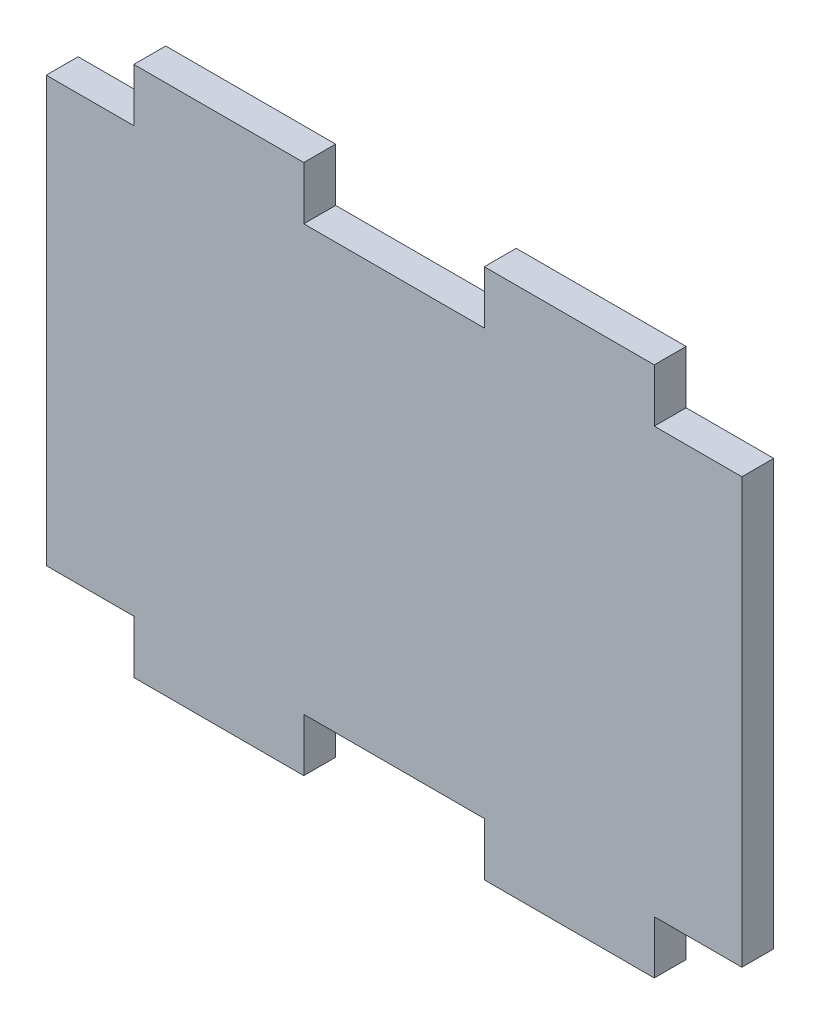
ISO-10303-21;
HEADER;
FILE_DESCRIPTION(('STEP AP214'),'2;1');
FILE_NAME('part.step','',(''),(''),'','','');
FILE_SCHEMA(('AUTOMOTIVE_DESIGN { 1 0 10303 214 1 1 1 1 }'));
ENDSEC;
DATA;
#1=APPLICATION_CONTEXT('core data for automotive mechanical design processes');
#2=APPLICATION_PROTOCOL_DEFINITION('international standard','automotive_design',2000,#1);
#3=PRODUCT_CONTEXT('',#1,'mechanical');
#4=PRODUCT('Part','Part','',(#3));
#5=PRODUCT_RELATED_PRODUCT_CATEGORY('part','',(#4));
#6=PRODUCT_DEFINITION_FORMATION('','',#4);
#7=PRODUCT_DEFINITION_CONTEXT('part definition',#1,'design');
#8=PRODUCT_DEFINITION('design','',#6,#7);
#9=PRODUCT_DEFINITION_SHAPE('','',#8);
#10=(LENGTH_UNIT() NAMED_UNIT(*) SI_UNIT(.MILLI.,.METRE.));
#11=(NAMED_UNIT(*) PLANE_ANGLE_UNIT() SI_UNIT($,.RADIAN.));
#12=(NAMED_UNIT(*) SI_UNIT($,.STERADIAN.) SOLID_ANGLE_UNIT());
#13=UNCERTAINTY_MEASURE_WITH_UNIT(LENGTH_MEASURE(1.E-05),#10,'distance_accuracy_value','');
#14=(GEOMETRIC_REPRESENTATION_CONTEXT(3) GLOBAL_UNCERTAINTY_ASSIGNED_CONTEXT((#13)) GLOBAL_UNIT_ASSIGNED_CONTEXT((#10,
#11,#12)) REPRESENTATION_CONTEXT('',''));
#15=CARTESIAN_POINT('',(0.,0.,0.));
#16=DIRECTION('',(0.,0.,1.));
#17=DIRECTION('',(1.,0.,0.));
#18=AXIS2_PLACEMENT_3D('',#15,#16,#17);
#19=CARTESIAN_POINT('',(-49.,6.,6.));
#20=DIRECTION('',(0.,-1.,0.));
#21=DIRECTION('',(1.,0.,0.));
#22=AXIS2_PLACEMENT_3D('',#19,#20,#21);
#23=PLANE('',#22);
#24=DIRECTION('',(-1.,0.,0.));
#25=VECTOR('',#24,1.);
#26=CARTESIAN_POINT('',(-49.,6.,0.));
#27=LINE('',#26,#25);
#28=CARTESIAN_POINT('',(-49.,6.,0.));
#29=VERTEX_POINT('',#28);
#30=CARTESIAN_POINT('',(-65.5,6.00000000000001,0.));
#31=VERTEX_POINT('',#30);
#32=EDGE_CURVE('E202',#29,#31,#27,.T.);
#33=ORIENTED_EDGE('',*,*,#32,.F.);
#34=DIRECTION('',(0.,0.,-1.));
#35=VECTOR('',#34,1.);
#36=CARTESIAN_POINT('',(-49.,6.,6.));
#37=LINE('',#36,#35);
#38=CARTESIAN_POINT('',(-49.,6.,6.));
#39=VERTEX_POINT('',#38);
#40=EDGE_CURVE('E11',#39,#29,#37,.T.);
#41=ORIENTED_EDGE('',*,*,#40,.F.);
#42=DIRECTION('',(-1.,0.,0.));
#43=VECTOR('',#42,1.);
#44=CARTESIAN_POINT('',(-49.,6.,6.));
#45=LINE('',#44,#43);
#46=CARTESIAN_POINT('',(-65.5,6.00000000000001,6.));
#47=VERTEX_POINT('',#46);
#48=EDGE_CURVE('E253',#39,#47,#45,.T.);
#49=ORIENTED_EDGE('',*,*,#48,.T.);
#50=DIRECTION('',(0.,0.,-1.));
#51=VECTOR('',#50,1.);
#52=CARTESIAN_POINT('',(-65.5,6.00000000000001,6.));
#53=LINE('',#52,#51);
#54=EDGE_CURVE('E36',#47,#31,#53,.T.);
#55=ORIENTED_EDGE('',*,*,#54,.T.);
#56=EDGE_LOOP('',(#33,#41,#49,#55));
#57=FACE_BOUND('',#56,.T.);
#58=ADVANCED_FACE('F33',(#57),#23,.T.);
#59=CARTESIAN_POINT('',(-49.,-3.99999999999999,6.));
#60=DIRECTION('',(-1.,0.,0.));
#61=DIRECTION('',(0.,-1.,0.));
#62=AXIS2_PLACEMENT_3D('',#59,#60,#61);
#63=PLANE('',#62);
#64=DIRECTION('',(0.,1.,0.));
#65=VECTOR('',#64,1.);
#66=CARTESIAN_POINT('',(-49.,-3.99999999999999,0.));
#67=LINE('',#66,#65);
#68=CARTESIAN_POINT('',(-49.,-3.99999999999999,0.));
#69=VERTEX_POINT('',#68);
#70=EDGE_CURVE('E251',#69,#29,#67,.T.);
#71=ORIENTED_EDGE('',*,*,#70,.F.);
#72=DIRECTION('',(0.,0.,-1.));
#73=VECTOR('',#72,1.);
#74=CARTESIAN_POINT('',(-49.,-3.99999999999999,6.));
#75=LINE('',#74,#73);
#76=CARTESIAN_POINT('',(-49.,-3.99999999999999,6.));
#77=VERTEX_POINT('',#76);
#78=EDGE_CURVE('E42',#77,#69,#75,.T.);
#79=ORIENTED_EDGE('',*,*,#78,.F.);
#80=DIRECTION('',(0.,1.,0.));
#81=VECTOR('',#80,1.);
#82=CARTESIAN_POINT('',(-49.,-3.99999999999999,6.));
#83=LINE('',#82,#81);
#84=EDGE_CURVE('E182',#77,#39,#83,.T.);
#85=ORIENTED_EDGE('',*,*,#84,.T.);
#86=ORIENTED_EDGE('',*,*,#40,.T.);
#87=EDGE_LOOP('',(#71,#79,#85,#86));
#88=FACE_BOUND('',#87,.T.);
#89=ADVANCED_FACE('F295',(#88),#63,.T.);
#90=CARTESIAN_POINT('',(-49.,-3.99999999999999,6.));
#91=DIRECTION('',(0.,1.,0.));
#92=DIRECTION('',(-1.,0.,0.));
#93=AXIS2_PLACEMENT_3D('',#90,#91,#92);
#94=PLANE('',#93);
#95=DIRECTION('',(1.,0.,0.));
#96=VECTOR('',#95,1.);
#97=CARTESIAN_POINT('',(-49.,-3.99999999999999,0.));
#98=LINE('',#97,#96);
#99=CARTESIAN_POINT('',(-17.,-4.,0.));
#100=VERTEX_POINT('',#99);
#101=EDGE_CURVE('E187',#69,#100,#98,.T.);
#102=ORIENTED_EDGE('',*,*,#101,.T.);
#103=DIRECTION('',(0.,0.,-1.));
#104=VECTOR('',#103,1.);
#105=CARTESIAN_POINT('',(-17.,-4.,6.));
#106=LINE('',#105,#104);
#107=CARTESIAN_POINT('',(-17.,-4.,6.));
#108=VERTEX_POINT('',#107);
#109=EDGE_CURVE('E185',#108,#100,#106,.T.);
#110=ORIENTED_EDGE('',*,*,#109,.F.);
#111=DIRECTION('',(1.,0.,0.));
#112=VECTOR('',#111,1.);
#113=CARTESIAN_POINT('',(-49.,-3.99999999999999,6.));
#114=LINE('',#113,#112);
#115=EDGE_CURVE('E175',#77,#108,#114,.T.);
#116=ORIENTED_EDGE('',*,*,#115,.F.);
#117=ORIENTED_EDGE('',*,*,#78,.T.);
#118=EDGE_LOOP('',(#102,#110,#116,#117));
#119=FACE_BOUND('',#118,.T.);
#120=ADVANCED_FACE('F186',(#119),#94,.F.);
#121=CARTESIAN_POINT('',(-17.,-4.,6.));
#122=DIRECTION('',(-1.,0.,0.));
#123=DIRECTION('',(0.,-1.,0.));
#124=AXIS2_PLACEMENT_3D('',#121,#122,#123);
#125=PLANE('',#124);
#126=DIRECTION('',(0.,1.,0.));
#127=VECTOR('',#126,1.);
#128=CARTESIAN_POINT('',(-17.,-4.,0.));
#129=LINE('',#128,#127);
#130=CARTESIAN_POINT('',(-17.,6.,0.));
#131=VERTEX_POINT('',#130);
#132=EDGE_CURVE('E248',#100,#131,#129,.T.);
#133=ORIENTED_EDGE('',*,*,#132,.T.);
#134=DIRECTION('',(0.,0.,-1.));
#135=VECTOR('',#134,1.);
#136=CARTESIAN_POINT('',(-17.,6.,6.));
#137=LINE('',#136,#135);
#138=CARTESIAN_POINT('',(-17.,6.,6.));
#139=VERTEX_POINT('',#138);
#140=EDGE_CURVE('E191',#139,#131,#137,.T.);
#141=ORIENTED_EDGE('',*,*,#140,.F.);
#142=DIRECTION('',(0.,1.,0.));
#143=VECTOR('',#142,1.);
#144=CARTESIAN_POINT('',(-17.,-4.,6.));
#145=LINE('',#144,#143);
#146=EDGE_CURVE('E180',#108,#139,#145,.T.);
#147=ORIENTED_EDGE('',*,*,#146,.F.);
#148=ORIENTED_EDGE('',*,*,#109,.T.);
#149=EDGE_LOOP('',(#133,#141,#147,#148));
#150=FACE_BOUND('',#149,.T.);
#151=ADVANCED_FACE('F193',(#150),#125,.F.);
#152=CARTESIAN_POINT('',(17.,6.,6.));
#153=DIRECTION('',(0.,-1.,0.));
#154=DIRECTION('',(0.,0.,-1.));
#155=AXIS2_PLACEMENT_3D('',#152,#153,#154);
#156=PLANE('',#155);
#157=DIRECTION('',(-1.,0.,0.));
#158=VECTOR('',#157,1.);
#159=CARTESIAN_POINT('',(17.,6.,0.));
#160=LINE('',#159,#158);
#161=CARTESIAN_POINT('',(17.,6.,0.));
#162=VERTEX_POINT('',#161);
#163=EDGE_CURVE('E245',#162,#131,#160,.T.);
#164=ORIENTED_EDGE('',*,*,#163,.F.);
#165=DIRECTION('',(0.,0.,-1.));
#166=VECTOR('',#165,1.);
#167=CARTESIAN_POINT('',(17.,6.,6.));
#168=LINE('',#167,#166);
#169=CARTESIAN_POINT('',(17.,6.,6.));
#170=VERTEX_POINT('',#169);
#171=EDGE_CURVE('E257',#170,#162,#168,.T.);
#172=ORIENTED_EDGE('',*,*,#171,.F.);
#173=DIRECTION('',(-1.,0.,0.));
#174=VECTOR('',#173,1.);
#175=CARTESIAN_POINT('',(17.,6.,6.));
#176=LINE('',#175,#174);
#177=EDGE_CURVE('E195',#170,#139,#176,.T.);
#178=ORIENTED_EDGE('',*,*,#177,.T.);
#179=ORIENTED_EDGE('',*,*,#140,.T.);
#180=EDGE_LOOP('',(#164,#172,#178,#179));
#181=FACE_BOUND('',#180,.T.);
#182=ADVANCED_FACE('F308',(#181),#156,.T.);
#183=CARTESIAN_POINT('',(17.,-4.,6.));
#184=DIRECTION('',(-1.,0.,0.));
#185=DIRECTION('',(0.,-1.,0.));
#186=AXIS2_PLACEMENT_3D('',#183,#184,#185);
#187=PLANE('',#186);
#188=DIRECTION('',(0.,1.,0.));
#189=VECTOR('',#188,1.);
#190=CARTESIAN_POINT('',(17.,-4.,0.));
#191=LINE('',#190,#189);
#192=CARTESIAN_POINT('',(17.,-4.,0.));
#193=VERTEX_POINT('',#192);
#194=EDGE_CURVE('E242',#193,#162,#191,.T.);
#195=ORIENTED_EDGE('',*,*,#194,.F.);
#196=DIRECTION('',(0.,0.,-1.));
#197=VECTOR('',#196,1.);
#198=CARTESIAN_POINT('',(17.,-4.,6.));
#199=LINE('',#198,#197);
#200=CARTESIAN_POINT('',(17.,-4.,6.));
#201=VERTEX_POINT('',#200);
#202=EDGE_CURVE('E259',#201,#193,#199,.T.);
#203=ORIENTED_EDGE('',*,*,#202,.F.);
#204=DIRECTION('',(0.,1.,0.));
#205=VECTOR('',#204,1.);
#206=CARTESIAN_POINT('',(17.,-4.,6.));
#207=LINE('',#206,#205);
#208=EDGE_CURVE('E197',#201,#170,#207,.T.);
#209=ORIENTED_EDGE('',*,*,#208,.T.);
#210=ORIENTED_EDGE('',*,*,#171,.T.);
#211=EDGE_LOOP('',(#195,#203,#209,#210));
#212=FACE_BOUND('',#211,.T.);
#213=ADVANCED_FACE('F311',(#212),#187,.T.);
#214=CARTESIAN_POINT('',(49.,-4.,6.));
#215=DIRECTION('',(0.,-1.,0.));
#216=DIRECTION('',(1.,0.,0.));
#217=AXIS2_PLACEMENT_3D('',#214,#215,#216);
#218=PLANE('',#217);
#219=DIRECTION('',(-1.,0.,0.));
#220=VECTOR('',#219,1.);
#221=CARTESIAN_POINT('',(49.,-4.,0.));
#222=LINE('',#221,#220);
#223=CARTESIAN_POINT('',(49.,-4.,0.));
#224=VERTEX_POINT('',#223);
#225=EDGE_CURVE('E239',#224,#193,#222,.T.);
#226=ORIENTED_EDGE('',*,*,#225,.F.);
#227=DIRECTION('',(0.,0.,-1.));
#228=VECTOR('',#227,1.);
#229=CARTESIAN_POINT('',(49.,-4.,6.));
#230=LINE('',#229,#228);
#231=CARTESIAN_POINT('',(49.,-4.,6.));
#232=VERTEX_POINT('',#231);
#233=EDGE_CURVE('E261',#232,#224,#230,.T.);
#234=ORIENTED_EDGE('',*,*,#233,.F.);
#235=DIRECTION('',(-1.,0.,0.));
#236=VECTOR('',#235,1.);
#237=CARTESIAN_POINT('',(49.,-4.,6.));
#238=LINE('',#237,#236);
#239=EDGE_CURVE('E546',#232,#201,#238,.T.);
#240=ORIENTED_EDGE('',*,*,#239,.T.);
#241=ORIENTED_EDGE('',*,*,#202,.T.);
#242=EDGE_LOOP('',(#226,#234,#240,#241));
#243=FACE_BOUND('',#242,.T.);
#244=ADVANCED_FACE('F315',(#243),#218,.T.);
#245=CARTESIAN_POINT('',(49.,-4.,6.));
#246=DIRECTION('',(-1.,0.,0.));
#247=DIRECTION('',(0.,-1.,0.));
#248=AXIS2_PLACEMENT_3D('',#245,#246,#247);
#249=PLANE('',#248);
#250=DIRECTION('',(0.,1.,0.));
#251=VECTOR('',#250,1.);
#252=CARTESIAN_POINT('',(49.,-4.,0.));
#253=LINE('',#252,#251);
#254=CARTESIAN_POINT('',(49.,6.,0.));
#255=VERTEX_POINT('',#254);
#256=EDGE_CURVE('E237',#224,#255,#253,.T.);
#257=ORIENTED_EDGE('',*,*,#256,.T.);
#258=DIRECTION('',(0.,0.,-1.));
#259=VECTOR('',#258,1.);
#260=CARTESIAN_POINT('',(49.,6.,6.));
#261=LINE('',#260,#259);
#262=CARTESIAN_POINT('',(49.,6.,6.));
#263=VERTEX_POINT('',#262);
#264=EDGE_CURVE('E263',#263,#255,#261,.T.);
#265=ORIENTED_EDGE('',*,*,#264,.F.);
#266=DIRECTION('',(0.,1.,0.));
#267=VECTOR('',#266,1.);
#268=CARTESIAN_POINT('',(49.,-4.,6.));
#269=LINE('',#268,#267);
#270=EDGE_CURVE('E541',#232,#263,#269,.T.);
#271=ORIENTED_EDGE('',*,*,#270,.F.);
#272=ORIENTED_EDGE('',*,*,#233,.T.);
#273=EDGE_LOOP('',(#257,#265,#271,#272));
#274=FACE_BOUND('',#273,.T.);
#275=ADVANCED_FACE('F319',(#274),#249,.F.);
#276=CARTESIAN_POINT('',(49.,6.,6.));
#277=DIRECTION('',(0.,1.,0.));
#278=DIRECTION('',(0.,0.,1.));
#279=AXIS2_PLACEMENT_3D('',#276,#277,#278);
#280=PLANE('',#279);
#281=DIRECTION('',(1.,0.,0.));
#282=VECTOR('',#281,1.);
#283=CARTESIAN_POINT('',(49.,6.,0.));
#284=LINE('',#283,#282);
#285=CARTESIAN_POINT('',(65.5,6.,0.));
#286=VERTEX_POINT('',#285);
#287=EDGE_CURVE('E235',#255,#286,#284,.T.);
#288=ORIENTED_EDGE('',*,*,#287,.T.);
#289=DIRECTION('',(0.,0.,-1.));
#290=VECTOR('',#289,1.);
#291=CARTESIAN_POINT('',(65.5,6.,6.));
#292=LINE('',#291,#290);
#293=CARTESIAN_POINT('',(65.5,6.,6.));
#294=VERTEX_POINT('',#293);
#295=EDGE_CURVE('E266',#294,#286,#292,.T.);
#296=ORIENTED_EDGE('',*,*,#295,.F.);
#297=DIRECTION('',(1.,0.,0.));
#298=VECTOR('',#297,1.);
#299=CARTESIAN_POINT('',(49.,6.,6.));
#300=LINE('',#299,#298);
#301=EDGE_CURVE('E538',#263,#294,#300,.T.);
#302=ORIENTED_EDGE('',*,*,#301,.F.);
#303=ORIENTED_EDGE('',*,*,#264,.T.);
#304=EDGE_LOOP('',(#288,#296,#302,#303));
#305=FACE_BOUND('',#304,.T.);
#306=ADVANCED_FACE('F323',(#305),#280,.F.);
#307=CARTESIAN_POINT('',(65.5,6.,6.));
#308=DIRECTION('',(-1.,0.,0.));
#309=DIRECTION('',(0.,0.,1.));
#310=AXIS2_PLACEMENT_3D('',#307,#308,#309);
#311=PLANE('',#310);
#312=DIRECTION('',(0.,1.,0.));
#313=VECTOR('',#312,1.);
#314=CARTESIAN_POINT('',(65.5,6.,0.));
#315=LINE('',#314,#313);
#316=CARTESIAN_POINT('',(65.5,86.,0.));
#317=VERTEX_POINT('',#316);
#318=EDGE_CURVE('E232',#286,#317,#315,.T.);
#319=ORIENTED_EDGE('',*,*,#318,.T.);
#320=DIRECTION('',(0.,0.,-1.));
#321=VECTOR('',#320,1.);
#322=CARTESIAN_POINT('',(65.5,86.,6.));
#323=LINE('',#322,#321);
#324=CARTESIAN_POINT('',(65.5,86.,6.));
#325=VERTEX_POINT('',#324);
#326=EDGE_CURVE('E269',#325,#317,#323,.T.);
#327=ORIENTED_EDGE('',*,*,#326,.F.);
#328=DIRECTION('',(0.,1.,0.));
#329=VECTOR('',#328,1.);
#330=CARTESIAN_POINT('',(65.5,6.,6.));
#331=LINE('',#330,#329);
#332=EDGE_CURVE('E536',#294,#325,#331,.T.);
#333=ORIENTED_EDGE('',*,*,#332,.F.);
#334=ORIENTED_EDGE('',*,*,#295,.T.);
#335=EDGE_LOOP('',(#319,#327,#333,#334));
#336=FACE_BOUND('',#335,.T.);
#337=ADVANCED_FACE('F327',(#336),#311,.F.);
#338=CARTESIAN_POINT('',(49.,86.,6.));
#339=DIRECTION('',(0.,1.,0.));
#340=DIRECTION('',(0.,0.,1.));
#341=AXIS2_PLACEMENT_3D('',#338,#339,#340);
#342=PLANE('',#341);
#343=DIRECTION('',(1.,0.,0.));
#344=VECTOR('',#343,1.);
#345=CARTESIAN_POINT('',(49.,86.,0.));
#346=LINE('',#345,#344);
#347=CARTESIAN_POINT('',(49.,86.,0.));
#348=VERTEX_POINT('',#347);
#349=EDGE_CURVE('E229',#348,#317,#346,.T.);
#350=ORIENTED_EDGE('',*,*,#349,.F.);
#351=DIRECTION('',(0.,0.,-1.));
#352=VECTOR('',#351,1.);
#353=CARTESIAN_POINT('',(49.,86.,6.));
#354=LINE('',#353,#352);
#355=CARTESIAN_POINT('',(49.,86.,6.));
#356=VERTEX_POINT('',#355);
#357=EDGE_CURVE('E271',#356,#348,#354,.T.);
#358=ORIENTED_EDGE('',*,*,#357,.F.);
#359=DIRECTION('',(1.,0.,0.));
#360=VECTOR('',#359,1.);
#361=CARTESIAN_POINT('',(49.,86.,6.));
#362=LINE('',#361,#360);
#363=EDGE_CURVE('E555',#356,#325,#362,.T.);
#364=ORIENTED_EDGE('',*,*,#363,.T.);
#365=ORIENTED_EDGE('',*,*,#326,.T.);
#366=EDGE_LOOP('',(#350,#358,#364,#365));
#367=FACE_BOUND('',#366,.T.);
#368=ADVANCED_FACE('F331',(#367),#342,.T.);
#369=CARTESIAN_POINT('',(49.,96.,6.));
#370=DIRECTION('',(1.,0.,0.));
#371=DIRECTION('',(0.,1.,0.));
#372=AXIS2_PLACEMENT_3D('',#369,#370,#371);
#373=PLANE('',#372);
#374=DIRECTION('',(0.,-1.,0.));
#375=VECTOR('',#374,1.);
#376=CARTESIAN_POINT('',(49.,96.,0.));
#377=LINE('',#376,#375);
#378=CARTESIAN_POINT('',(49.,96.,0.));
#379=VERTEX_POINT('',#378);
#380=EDGE_CURVE('E226',#379,#348,#377,.T.);
#381=ORIENTED_EDGE('',*,*,#380,.F.);
#382=DIRECTION('',(0.,0.,-1.));
#383=VECTOR('',#382,1.);
#384=CARTESIAN_POINT('',(49.,96.,6.));
#385=LINE('',#384,#383);
#386=CARTESIAN_POINT('',(49.,96.,6.));
#387=VERTEX_POINT('',#386);
#388=EDGE_CURVE('E273',#387,#379,#385,.T.);
#389=ORIENTED_EDGE('',*,*,#388,.F.);
#390=DIRECTION('',(0.,-1.,0.));
#391=VECTOR('',#390,1.);
#392=CARTESIAN_POINT('',(49.,96.,6.));
#393=LINE('',#392,#391);
#394=EDGE_CURVE('E527',#387,#356,#393,.T.);
#395=ORIENTED_EDGE('',*,*,#394,.T.);
#396=ORIENTED_EDGE('',*,*,#357,.T.);
#397=EDGE_LOOP('',(#381,#389,#395,#396));
#398=FACE_BOUND('',#397,.T.);
#399=ADVANCED_FACE('F335',(#398),#373,.T.);
#400=CARTESIAN_POINT('',(49.,96.,6.));
#401=DIRECTION('',(0.,-1.,0.));
#402=DIRECTION('',(0.,0.,-1.));
#403=AXIS2_PLACEMENT_3D('',#400,#401,#402);
#404=PLANE('',#403);
#405=DIRECTION('',(-1.,0.,0.));
#406=VECTOR('',#405,1.);
#407=CARTESIAN_POINT('',(49.,96.,0.));
#408=LINE('',#407,#406);
#409=CARTESIAN_POINT('',(17.,96.,0.));
#410=VERTEX_POINT('',#409);
#411=EDGE_CURVE('E224',#379,#410,#408,.T.);
#412=ORIENTED_EDGE('',*,*,#411,.T.);
#413=DIRECTION('',(0.,0.,-1.));
#414=VECTOR('',#413,1.);
#415=CARTESIAN_POINT('',(17.,96.,6.));
#416=LINE('',#415,#414);
#417=CARTESIAN_POINT('',(17.,96.,6.));
#418=VERTEX_POINT('',#417);
#419=EDGE_CURVE('E275',#418,#410,#416,.T.);
#420=ORIENTED_EDGE('',*,*,#419,.F.);
#421=DIRECTION('',(-1.,0.,0.));
#422=VECTOR('',#421,1.);
#423=CARTESIAN_POINT('',(49.,96.,6.));
#424=LINE('',#423,#422);
#425=EDGE_CURVE('E522',#387,#418,#424,.T.);
#426=ORIENTED_EDGE('',*,*,#425,.F.);
#427=ORIENTED_EDGE('',*,*,#388,.T.);
#428=EDGE_LOOP('',(#412,#420,#426,#427));
#429=FACE_BOUND('',#428,.T.);
#430=ADVANCED_FACE('F339',(#429),#404,.F.);
#431=CARTESIAN_POINT('',(17.,96.,6.));
#432=DIRECTION('',(1.,0.,0.));
#433=DIRECTION('',(0.,1.,0.));
#434=AXIS2_PLACEMENT_3D('',#431,#432,#433);
#435=PLANE('',#434);
#436=DIRECTION('',(0.,-1.,0.));
#437=VECTOR('',#436,1.);
#438=CARTESIAN_POINT('',(17.,96.,0.));
#439=LINE('',#438,#437);
#440=CARTESIAN_POINT('',(17.,86.,0.));
#441=VERTEX_POINT('',#440);
#442=EDGE_CURVE('E222',#410,#441,#439,.T.);
#443=ORIENTED_EDGE('',*,*,#442,.T.);
#444=DIRECTION('',(0.,0.,-1.));
#445=VECTOR('',#444,1.);
#446=CARTESIAN_POINT('',(17.,86.,6.));
#447=LINE('',#446,#445);
#448=CARTESIAN_POINT('',(17.,86.,6.));
#449=VERTEX_POINT('',#448);
#450=EDGE_CURVE('E278',#449,#441,#447,.T.);
#451=ORIENTED_EDGE('',*,*,#450,.F.);
#452=DIRECTION('',(0.,-1.,0.));
#453=VECTOR('',#452,1.);
#454=CARTESIAN_POINT('',(17.,96.,6.));
#455=LINE('',#454,#453);
#456=EDGE_CURVE('E519',#418,#449,#455,.T.);
#457=ORIENTED_EDGE('',*,*,#456,.F.);
#458=ORIENTED_EDGE('',*,*,#419,.T.);
#459=EDGE_LOOP('',(#443,#451,#457,#458));
#460=FACE_BOUND('',#459,.T.);
#461=ADVANCED_FACE('F343',(#460),#435,.F.);
#462=CARTESIAN_POINT('',(17.,86.,6.));
#463=DIRECTION('',(0.,-1.,0.));
#464=DIRECTION('',(0.,0.,-1.));
#465=AXIS2_PLACEMENT_3D('',#462,#463,#464);
#466=PLANE('',#465);
#467=DIRECTION('',(-1.,0.,0.));
#468=VECTOR('',#467,1.);
#469=CARTESIAN_POINT('',(17.,86.,0.));
#470=LINE('',#469,#468);
#471=CARTESIAN_POINT('',(-17.,86.,0.));
#472=VERTEX_POINT('',#471);
#473=EDGE_CURVE('E219',#441,#472,#470,.T.);
#474=ORIENTED_EDGE('',*,*,#473,.T.);
#475=DIRECTION('',(0.,0.,-1.));
#476=VECTOR('',#475,1.);
#477=CARTESIAN_POINT('',(-17.,86.,6.));
#478=LINE('',#477,#476);
#479=CARTESIAN_POINT('',(-17.,86.,6.));
#480=VERTEX_POINT('',#479);
#481=EDGE_CURVE('E281',#480,#472,#478,.T.);
#482=ORIENTED_EDGE('',*,*,#481,.F.);
#483=DIRECTION('',(-1.,0.,0.));
#484=VECTOR('',#483,1.);
#485=CARTESIAN_POINT('',(17.,86.,6.));
#486=LINE('',#485,#484);
#487=EDGE_CURVE('E517',#449,#480,#486,.T.);
#488=ORIENTED_EDGE('',*,*,#487,.F.);
#489=ORIENTED_EDGE('',*,*,#450,.T.);
#490=EDGE_LOOP('',(#474,#482,#488,#489));
#491=FACE_BOUND('',#490,.T.);
#492=ADVANCED_FACE('F347',(#491),#466,.F.);
#493=CARTESIAN_POINT('',(-17.,96.,6.));
#494=DIRECTION('',(1.,0.,0.));
#495=DIRECTION('',(0.,1.,0.));
#496=AXIS2_PLACEMENT_3D('',#493,#494,#495);
#497=PLANE('',#496);
#498=DIRECTION('',(0.,-1.,0.));
#499=VECTOR('',#498,1.);
#500=CARTESIAN_POINT('',(-17.,96.,0.));
#501=LINE('',#500,#499);
#502=CARTESIAN_POINT('',(-17.,96.,0.));
#503=VERTEX_POINT('',#502);
#504=EDGE_CURVE('E216',#503,#472,#501,.T.);
#505=ORIENTED_EDGE('',*,*,#504,.F.);
#506=DIRECTION('',(0.,0.,-1.));
#507=VECTOR('',#506,1.);
#508=CARTESIAN_POINT('',(-17.,96.,6.));
#509=LINE('',#508,#507);
#510=CARTESIAN_POINT('',(-17.,96.,6.));
#511=VERTEX_POINT('',#510);
#512=EDGE_CURVE('E283',#511,#503,#509,.T.);
#513=ORIENTED_EDGE('',*,*,#512,.F.);
#514=DIRECTION('',(0.,-1.,0.));
#515=VECTOR('',#514,1.);
#516=CARTESIAN_POINT('',(-17.,96.,6.));
#517=LINE('',#516,#515);
#518=EDGE_CURVE('E561',#511,#480,#517,.T.);
#519=ORIENTED_EDGE('',*,*,#518,.T.);
#520=ORIENTED_EDGE('',*,*,#481,.T.);
#521=EDGE_LOOP('',(#505,#513,#519,#520));
#522=FACE_BOUND('',#521,.T.);
#523=ADVANCED_FACE('F351',(#522),#497,.T.);
#524=CARTESIAN_POINT('',(-49.,96.,6.));
#525=DIRECTION('',(0.,1.,0.));
#526=DIRECTION('',(-1.,0.,0.));
#527=AXIS2_PLACEMENT_3D('',#524,#525,#526);
#528=PLANE('',#527);
#529=DIRECTION('',(1.,0.,0.));
#530=VECTOR('',#529,1.);
#531=CARTESIAN_POINT('',(-49.,96.,0.));
#532=LINE('',#531,#530);
#533=CARTESIAN_POINT('',(-49.,96.,0.));
#534=VERTEX_POINT('',#533);
#535=EDGE_CURVE('E213',#534,#503,#532,.T.);
#536=ORIENTED_EDGE('',*,*,#535,.F.);
#537=DIRECTION('',(0.,0.,-1.));
#538=VECTOR('',#537,1.);
#539=CARTESIAN_POINT('',(-49.,96.,6.));
#540=LINE('',#539,#538);
#541=CARTESIAN_POINT('',(-49.,96.,6.));
#542=VERTEX_POINT('',#541);
#543=EDGE_CURVE('E285',#542,#534,#540,.T.);
#544=ORIENTED_EDGE('',*,*,#543,.F.);
#545=DIRECTION('',(1.,0.,0.));
#546=VECTOR('',#545,1.);
#547=CARTESIAN_POINT('',(-49.,96.,6.));
#548=LINE('',#547,#546);
#549=EDGE_CURVE('E508',#542,#511,#548,.T.);
#550=ORIENTED_EDGE('',*,*,#549,.T.);
#551=ORIENTED_EDGE('',*,*,#512,.T.);
#552=EDGE_LOOP('',(#536,#544,#550,#551));
#553=FACE_BOUND('',#552,.T.);
#554=ADVANCED_FACE('F355',(#553),#528,.T.);
#555=CARTESIAN_POINT('',(-49.,96.,6.));
#556=DIRECTION('',(1.,0.,0.));
#557=DIRECTION('',(0.,1.,0.));
#558=AXIS2_PLACEMENT_3D('',#555,#556,#557);
#559=PLANE('',#558);
#560=DIRECTION('',(0.,-1.,0.));
#561=VECTOR('',#560,1.);
#562=CARTESIAN_POINT('',(-49.,96.,0.));
#563=LINE('',#562,#561);
#564=CARTESIAN_POINT('',(-49.,86.,0.));
#565=VERTEX_POINT('',#564);
#566=EDGE_CURVE('E211',#534,#565,#563,.T.);
#567=ORIENTED_EDGE('',*,*,#566,.T.);
#568=DIRECTION('',(0.,0.,-1.));
#569=VECTOR('',#568,1.);
#570=CARTESIAN_POINT('',(-49.,86.,6.));
#571=LINE('',#570,#569);
#572=CARTESIAN_POINT('',(-49.,86.,6.));
#573=VERTEX_POINT('',#572);
#574=EDGE_CURVE('E287',#573,#565,#571,.T.);
#575=ORIENTED_EDGE('',*,*,#574,.F.);
#576=DIRECTION('',(0.,-1.,0.));
#577=VECTOR('',#576,1.);
#578=CARTESIAN_POINT('',(-49.,96.,6.));
#579=LINE('',#578,#577);
#580=EDGE_CURVE('E564',#542,#573,#579,.T.);
#581=ORIENTED_EDGE('',*,*,#580,.F.);
#582=ORIENTED_EDGE('',*,*,#543,.T.);
#583=EDGE_LOOP('',(#567,#575,#581,#582));
#584=FACE_BOUND('',#583,.T.);
#585=ADVANCED_FACE('F359',(#584),#559,.F.);
#586=CARTESIAN_POINT('',(-49.,86.,6.));
#587=DIRECTION('',(0.,-1.,0.));
#588=DIRECTION('',(1.,0.,0.));
#589=AXIS2_PLACEMENT_3D('',#586,#587,#588);
#590=PLANE('',#589);
#591=DIRECTION('',(-1.,0.,0.));
#592=VECTOR('',#591,1.);
#593=CARTESIAN_POINT('',(-49.,86.,0.));
#594=LINE('',#593,#592);
#595=CARTESIAN_POINT('',(-65.5,86.,0.));
#596=VERTEX_POINT('',#595);
#597=EDGE_CURVE('E208',#565,#596,#594,.T.);
#598=ORIENTED_EDGE('',*,*,#597,.T.);
#599=DIRECTION('',(0.,0.,-1.));
#600=VECTOR('',#599,1.);
#601=CARTESIAN_POINT('',(-65.5,86.,6.));
#602=LINE('',#601,#600);
#603=CARTESIAN_POINT('',(-65.5,86.,6.));
#604=VERTEX_POINT('',#603);
#605=EDGE_CURVE('E289',#604,#596,#602,.T.);
#606=ORIENTED_EDGE('',*,*,#605,.F.);
#607=DIRECTION('',(-1.,0.,0.));
#608=VECTOR('',#607,1.);
#609=CARTESIAN_POINT('',(-49.,86.,6.));
#610=LINE('',#609,#608);
#611=EDGE_CURVE('E566',#573,#604,#610,.T.);
#612=ORIENTED_EDGE('',*,*,#611,.F.);
#613=ORIENTED_EDGE('',*,*,#574,.T.);
#614=EDGE_LOOP('',(#598,#606,#612,#613));
#615=FACE_BOUND('',#614,.T.);
#616=ADVANCED_FACE('F363',(#615),#590,.F.);
#617=CARTESIAN_POINT('',(-65.5,6.00000000000001,6.));
#618=DIRECTION('',(-1.,0.,0.));
#619=DIRECTION('',(0.,0.,1.));
#620=AXIS2_PLACEMENT_3D('',#617,#618,#619);
#621=PLANE('',#620);
#622=DIRECTION('',(0.,1.,0.));
#623=VECTOR('',#622,1.);
#624=CARTESIAN_POINT('',(-65.5,6.00000000000001,0.));
#625=LINE('',#624,#623);
#626=EDGE_CURVE('E205',#31,#596,#625,.T.);
#627=ORIENTED_EDGE('',*,*,#626,.F.);
#628=ORIENTED_EDGE('',*,*,#54,.F.);
#629=DIRECTION('',(0.,1.,0.));
#630=VECTOR('',#629,1.);
#631=CARTESIAN_POINT('',(-65.5,6.00000000000001,6.));
#632=LINE('',#631,#630);
#633=EDGE_CURVE('E568',#47,#604,#632,.T.);
#634=ORIENTED_EDGE('',*,*,#633,.T.);
#635=ORIENTED_EDGE('',*,*,#605,.T.);
#636=EDGE_LOOP('',(#627,#628,#634,#635));
#637=FACE_BOUND('',#636,.T.);
#638=ADVANCED_FACE('F291',(#637),#621,.T.);
#639=CARTESIAN_POINT('',(0.,0.,6.));
#640=DIRECTION('',(0.,0.,-1.));
#641=DIRECTION('',(-1.,0.,0.));
#642=AXIS2_PLACEMENT_3D('',#639,#640,#641);
#643=PLANE('',#642);
#644=ORIENTED_EDGE('',*,*,#48,.F.);
#645=ORIENTED_EDGE('',*,*,#84,.F.);
#646=ORIENTED_EDGE('',*,*,#115,.T.);
#647=ORIENTED_EDGE('',*,*,#146,.T.);
#648=ORIENTED_EDGE('',*,*,#177,.F.);
#649=ORIENTED_EDGE('',*,*,#208,.F.);
#650=ORIENTED_EDGE('',*,*,#239,.F.);
#651=ORIENTED_EDGE('',*,*,#270,.T.);
#652=ORIENTED_EDGE('',*,*,#301,.T.);
#653=ORIENTED_EDGE('',*,*,#332,.T.);
#654=ORIENTED_EDGE('',*,*,#363,.F.);
#655=ORIENTED_EDGE('',*,*,#394,.F.);
#656=ORIENTED_EDGE('',*,*,#425,.T.);
#657=ORIENTED_EDGE('',*,*,#456,.T.);
#658=ORIENTED_EDGE('',*,*,#487,.T.);
#659=ORIENTED_EDGE('',*,*,#518,.F.);
#660=ORIENTED_EDGE('',*,*,#549,.F.);
#661=ORIENTED_EDGE('',*,*,#580,.T.);
#662=ORIENTED_EDGE('',*,*,#611,.T.);
#663=ORIENTED_EDGE('',*,*,#633,.F.);
#664=EDGE_LOOP('',(#644,#645,#646,#647,#648,#649,#650,#651,#652,#653,#654,#655,#656,#657,#658,
#659,#660,#661,#662,#663));
#665=FACE_BOUND('',#664,.T.);
#666=ADVANCED_FACE('F177',(#665),#643,.F.);
#667=CARTESIAN_POINT('',(0.,0.,0.));
#668=DIRECTION('',(0.,0.,-1.));
#669=DIRECTION('',(-1.,0.,0.));
#670=AXIS2_PLACEMENT_3D('',#667,#668,#669);
#671=PLANE('',#670);
#672=ORIENTED_EDGE('',*,*,#32,.T.);
#673=ORIENTED_EDGE('',*,*,#626,.T.);
#674=ORIENTED_EDGE('',*,*,#597,.F.);
#675=ORIENTED_EDGE('',*,*,#566,.F.);
#676=ORIENTED_EDGE('',*,*,#535,.T.);
#677=ORIENTED_EDGE('',*,*,#504,.T.);
#678=ORIENTED_EDGE('',*,*,#473,.F.);
#679=ORIENTED_EDGE('',*,*,#442,.F.);
#680=ORIENTED_EDGE('',*,*,#411,.F.);
#681=ORIENTED_EDGE('',*,*,#380,.T.);
#682=ORIENTED_EDGE('',*,*,#349,.T.);
#683=ORIENTED_EDGE('',*,*,#318,.F.);
#684=ORIENTED_EDGE('',*,*,#287,.F.);
#685=ORIENTED_EDGE('',*,*,#256,.F.);
#686=ORIENTED_EDGE('',*,*,#225,.T.);
#687=ORIENTED_EDGE('',*,*,#194,.T.);
#688=ORIENTED_EDGE('',*,*,#163,.T.);
#689=ORIENTED_EDGE('',*,*,#132,.F.);
#690=ORIENTED_EDGE('',*,*,#101,.F.);
#691=ORIENTED_EDGE('',*,*,#70,.T.);
#692=EDGE_LOOP('',(#672,#673,#674,#675,#676,#677,#678,#679,#680,#681,#682,#683,#684,#685,#686,
#687,#688,#689,#690,#691));
#693=FACE_BOUND('',#692,.T.);
#694=ADVANCED_FACE('F294',(#693),#671,.T.);
#695=CLOSED_SHELL('',(#58,#89,#120,#151,#182,#213,#244,#275,#306,#337,#368,#399,#430,#461,#492,
#523,#554,#585,#616,#638,#666,#694));
#696=MANIFOLD_SOLID_BREP('B2',#695);
#697=ADVANCED_BREP_SHAPE_REPRESENTATION('',(#18,#696),#14);
#698=SHAPE_DEFINITION_REPRESENTATION(#9,#697);
ENDSEC;
END-ISO-10303-21;
